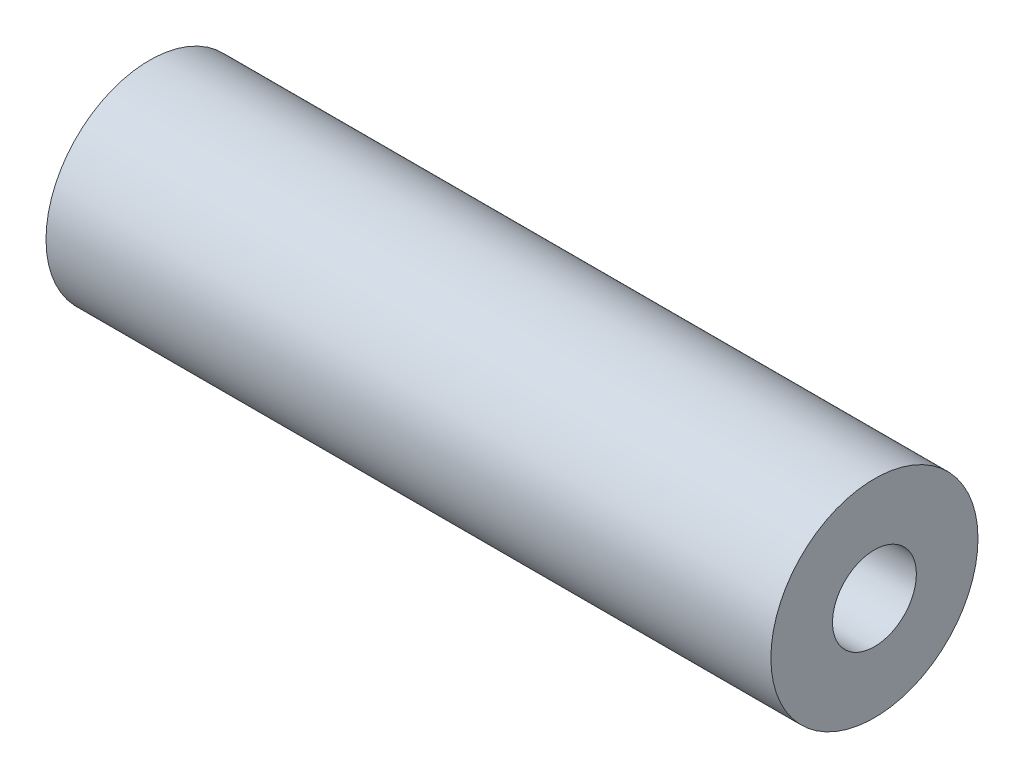
ISO-10303-21;
HEADER;
FILE_DESCRIPTION(('STEP AP214'),'2;1');
FILE_NAME('part.step','',(''),(''),'','','');
FILE_SCHEMA(('AUTOMOTIVE_DESIGN { 1 0 10303 214 1 1 1 1 }'));
ENDSEC;
DATA;
#1=APPLICATION_CONTEXT('core data for automotive mechanical design processes');
#2=APPLICATION_PROTOCOL_DEFINITION('international standard','automotive_design',2000,#1);
#3=PRODUCT_CONTEXT('',#1,'mechanical');
#4=PRODUCT('Part','Part','',(#3));
#5=PRODUCT_RELATED_PRODUCT_CATEGORY('part','',(#4));
#6=PRODUCT_DEFINITION_FORMATION('','',#4);
#7=PRODUCT_DEFINITION_CONTEXT('part definition',#1,'design');
#8=PRODUCT_DEFINITION('design','',#6,#7);
#9=PRODUCT_DEFINITION_SHAPE('','',#8);
#10=(LENGTH_UNIT() NAMED_UNIT(*) SI_UNIT(.MILLI.,.METRE.));
#11=(NAMED_UNIT(*) PLANE_ANGLE_UNIT() SI_UNIT($,.RADIAN.));
#12=(NAMED_UNIT(*) SI_UNIT($,.STERADIAN.) SOLID_ANGLE_UNIT());
#13=UNCERTAINTY_MEASURE_WITH_UNIT(LENGTH_MEASURE(1.E-05),#10,'distance_accuracy_value','');
#14=(GEOMETRIC_REPRESENTATION_CONTEXT(3) GLOBAL_UNCERTAINTY_ASSIGNED_CONTEXT((#13)) GLOBAL_UNIT_ASSIGNED_CONTEXT((#10,
#11,#12)) REPRESENTATION_CONTEXT('',''));
#15=CARTESIAN_POINT('',(0.,0.,0.));
#16=DIRECTION('',(0.,0.,1.));
#17=DIRECTION('',(1.,0.,0.));
#18=AXIS2_PLACEMENT_3D('',#15,#16,#17);
#19=CARTESIAN_POINT('',(140.,0.,0.));
#20=DIRECTION('',(1.,0.,0.));
#21=DIRECTION('',(0.,0.,-1.));
#22=AXIS2_PLACEMENT_3D('',#19,#20,#21);
#23=PLANE('',#22);
#24=CARTESIAN_POINT('',(140.,0.,0.));
#25=DIRECTION('',(1.,0.,0.));
#26=DIRECTION('',(0.,0.,-1.));
#27=AXIS2_PLACEMENT_3D('',#24,#25,#26);
#28=CIRCLE('',#27,20.);
#29=CARTESIAN_POINT('',(140.,0.,-20.));
#30=VERTEX_POINT('',#29);
#31=EDGE_CURVE('E10',#30,#30,#28,.T.);
#32=ORIENTED_EDGE('',*,*,#31,.T.);
#33=EDGE_LOOP('',(#32));
#34=FACE_BOUND('',#33,.T.);
#35=CARTESIAN_POINT('',(140.,0.,0.));
#36=DIRECTION('',(1.,0.,0.));
#37=DIRECTION('',(0.,0.,-1.));
#38=AXIS2_PLACEMENT_3D('',#35,#36,#37);
#39=CIRCLE('',#38,8.1);
#40=CARTESIAN_POINT('',(140.,0.,-8.1));
#41=VERTEX_POINT('',#40);
#42=EDGE_CURVE('E54',#41,#41,#39,.T.);
#43=ORIENTED_EDGE('',*,*,#42,.F.);
#44=EDGE_LOOP('',(#43));
#45=FACE_BOUND('',#44,.T.);
#46=ADVANCED_FACE('F41',(#34,#45),#23,.T.);
#47=CARTESIAN_POINT('',(0.,0.,0.));
#48=DIRECTION('',(1.,0.,0.));
#49=DIRECTION('',(0.,0.,-1.));
#50=AXIS2_PLACEMENT_3D('',#47,#48,#49);
#51=PLANE('',#50);
#52=CARTESIAN_POINT('',(0.,0.,0.));
#53=DIRECTION('',(1.,0.,0.));
#54=DIRECTION('',(0.,0.,-1.));
#55=AXIS2_PLACEMENT_3D('',#52,#53,#54);
#56=CIRCLE('',#55,20.);
#57=CARTESIAN_POINT('',(0.,0.,-20.));
#58=VERTEX_POINT('',#57);
#59=EDGE_CURVE('E45',#58,#58,#56,.T.);
#60=ORIENTED_EDGE('',*,*,#59,.F.);
#61=EDGE_LOOP('',(#60));
#62=FACE_BOUND('',#61,.T.);
#63=CARTESIAN_POINT('',(0.,0.,0.));
#64=DIRECTION('',(1.,0.,0.));
#65=DIRECTION('',(0.,0.,-1.));
#66=AXIS2_PLACEMENT_3D('',#63,#64,#65);
#67=CIRCLE('',#66,8.1);
#68=CARTESIAN_POINT('',(0.,0.,-8.1));
#69=VERTEX_POINT('',#68);
#70=EDGE_CURVE('E56',#69,#69,#67,.T.);
#71=ORIENTED_EDGE('',*,*,#70,.T.);
#72=EDGE_LOOP('',(#71));
#73=FACE_BOUND('',#72,.T.);
#74=ADVANCED_FACE('F68',(#62,#73),#51,.F.);
#75=CARTESIAN_POINT('',(140.,0.,0.));
#76=DIRECTION('',(-1.,0.,0.));
#77=DIRECTION('',(0.,0.,1.));
#78=AXIS2_PLACEMENT_3D('',#75,#76,#77);
#79=CYLINDRICAL_SURFACE('',#78,20.);
#80=ORIENTED_EDGE('',*,*,#31,.F.);
#81=EDGE_LOOP('',(#80));
#82=FACE_BOUND('',#81,.T.);
#83=ORIENTED_EDGE('',*,*,#59,.T.);
#84=EDGE_LOOP('',(#83));
#85=FACE_BOUND('',#84,.T.);
#86=ADVANCED_FACE('F43',(#82,#85),#79,.T.);
#87=CARTESIAN_POINT('',(140.,0.,0.));
#88=DIRECTION('',(-1.,0.,0.));
#89=DIRECTION('',(0.,0.,1.));
#90=AXIS2_PLACEMENT_3D('',#87,#88,#89);
#91=CYLINDRICAL_SURFACE('',#90,8.1);
#92=ORIENTED_EDGE('',*,*,#42,.T.);
#93=EDGE_LOOP('',(#92));
#94=FACE_BOUND('',#93,.T.);
#95=ORIENTED_EDGE('',*,*,#70,.F.);
#96=EDGE_LOOP('',(#95));
#97=FACE_BOUND('',#96,.T.);
#98=ADVANCED_FACE('F64',(#94,#97),#91,.F.);
#99=CLOSED_SHELL('',(#46,#74,#86,#98));
#100=MANIFOLD_SOLID_BREP('B2',#99);
#101=ADVANCED_BREP_SHAPE_REPRESENTATION('',(#18,#100),#14);
#102=SHAPE_DEFINITION_REPRESENTATION(#9,#101);
ENDSEC;
END-ISO-10303-21;
